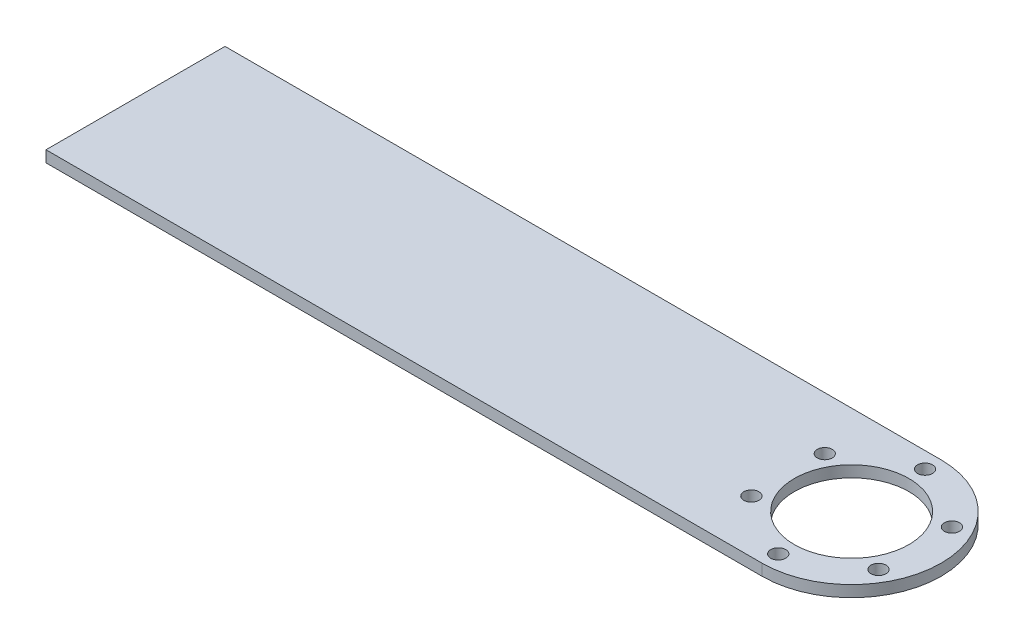
ISO-10303-21;
HEADER;
FILE_DESCRIPTION(('STEP AP214'),'2;1');
FILE_NAME('part.step','',(''),(''),'','','');
FILE_SCHEMA(('AUTOMOTIVE_DESIGN { 1 0 10303 214 1 1 1 1 }'));
ENDSEC;
DATA;
#1=APPLICATION_CONTEXT('core data for automotive mechanical design processes');
#2=APPLICATION_PROTOCOL_DEFINITION('international standard','automotive_design',2000,#1);
#3=PRODUCT_CONTEXT('',#1,'mechanical');
#4=PRODUCT('Part','Part','',(#3));
#5=PRODUCT_RELATED_PRODUCT_CATEGORY('part','',(#4));
#6=PRODUCT_DEFINITION_FORMATION('','',#4);
#7=PRODUCT_DEFINITION_CONTEXT('part definition',#1,'design');
#8=PRODUCT_DEFINITION('design','',#6,#7);
#9=PRODUCT_DEFINITION_SHAPE('','',#8);
#10=(LENGTH_UNIT() NAMED_UNIT(*) SI_UNIT(.MILLI.,.METRE.));
#11=(NAMED_UNIT(*) PLANE_ANGLE_UNIT() SI_UNIT($,.RADIAN.));
#12=(NAMED_UNIT(*) SI_UNIT($,.STERADIAN.) SOLID_ANGLE_UNIT());
#13=UNCERTAINTY_MEASURE_WITH_UNIT(LENGTH_MEASURE(1.E-05),#10,'distance_accuracy_value','');
#14=(GEOMETRIC_REPRESENTATION_CONTEXT(3) GLOBAL_UNCERTAINTY_ASSIGNED_CONTEXT((#13)) GLOBAL_UNIT_ASSIGNED_CONTEXT((#10,
#11,#12)) REPRESENTATION_CONTEXT('',''));
#15=CARTESIAN_POINT('',(0.,0.,0.));
#16=DIRECTION('',(0.,0.,1.));
#17=DIRECTION('',(1.,0.,0.));
#18=AXIS2_PLACEMENT_3D('',#15,#16,#17);
#19=CARTESIAN_POINT('',(100.,3.175,0.));
#20=DIRECTION('',(0.,-1.,0.));
#21=DIRECTION('',(0.,0.,-1.));
#22=AXIS2_PLACEMENT_3D('',#19,#20,#21);
#23=CYLINDRICAL_SURFACE('',#22,25.);
#24=CARTESIAN_POINT('',(100.,0.,0.));
#25=DIRECTION('',(0.,1.,0.));
#26=DIRECTION('',(0.,0.,1.));
#27=AXIS2_PLACEMENT_3D('',#24,#25,#26);
#28=CIRCLE('',#27,25.);
#29=CARTESIAN_POINT('',(100.,0.,25.));
#30=VERTEX_POINT('',#29);
#31=CARTESIAN_POINT('',(100.,0.,-25.));
#32=VERTEX_POINT('',#31);
#33=EDGE_CURVE('E111',#30,#32,#28,.T.);
#34=ORIENTED_EDGE('',*,*,#33,.T.);
#35=DIRECTION('',(0.,-1.,0.));
#36=VECTOR('',#35,1.);
#37=CARTESIAN_POINT('',(100.,3.175,-25.));
#38=LINE('',#37,#36);
#39=CARTESIAN_POINT('',(100.,3.175,-25.));
#40=VERTEX_POINT('',#39);
#41=EDGE_CURVE('E11',#40,#32,#38,.T.);
#42=ORIENTED_EDGE('',*,*,#41,.F.);
#43=CARTESIAN_POINT('',(100.,3.175,0.));
#44=DIRECTION('',(0.,1.,0.));
#45=DIRECTION('',(0.,0.,1.));
#46=AXIS2_PLACEMENT_3D('',#43,#44,#45);
#47=CIRCLE('',#46,25.);
#48=CARTESIAN_POINT('',(100.,3.175,25.));
#49=VERTEX_POINT('',#48);
#50=EDGE_CURVE('E95',#49,#40,#47,.T.);
#51=ORIENTED_EDGE('',*,*,#50,.F.);
#52=DIRECTION('',(0.,-1.,0.));
#53=VECTOR('',#52,1.);
#54=CARTESIAN_POINT('',(100.,3.175,25.));
#55=LINE('',#54,#53);
#56=EDGE_CURVE('E107',#49,#30,#55,.T.);
#57=ORIENTED_EDGE('',*,*,#56,.T.);
#58=EDGE_LOOP('',(#34,#42,#51,#57));
#59=FACE_BOUND('',#58,.T.);
#60=ADVANCED_FACE('F43',(#59),#23,.T.);
#61=CARTESIAN_POINT('',(-100.,3.175,-25.));
#62=DIRECTION('',(0.,0.,1.));
#63=DIRECTION('',(1.,0.,0.));
#64=AXIS2_PLACEMENT_3D('',#61,#62,#63);
#65=PLANE('',#64);
#66=DIRECTION('',(-1.,0.,0.));
#67=VECTOR('',#66,1.);
#68=CARTESIAN_POINT('',(-100.,0.,-25.));
#69=LINE('',#68,#67);
#70=CARTESIAN_POINT('',(-100.,0.,-25.));
#71=VERTEX_POINT('',#70);
#72=EDGE_CURVE('E100',#32,#71,#69,.T.);
#73=ORIENTED_EDGE('',*,*,#72,.T.);
#74=DIRECTION('',(0.,-1.,0.));
#75=VECTOR('',#74,1.);
#76=CARTESIAN_POINT('',(-100.,3.175,-25.));
#77=LINE('',#76,#75);
#78=CARTESIAN_POINT('',(-100.,3.175,-25.));
#79=VERTEX_POINT('',#78);
#80=EDGE_CURVE('E52',#79,#71,#77,.T.);
#81=ORIENTED_EDGE('',*,*,#80,.F.);
#82=DIRECTION('',(-1.,0.,0.));
#83=VECTOR('',#82,1.);
#84=CARTESIAN_POINT('',(-100.,3.175,-25.));
#85=LINE('',#84,#83);
#86=EDGE_CURVE('E90',#40,#79,#85,.T.);
#87=ORIENTED_EDGE('',*,*,#86,.F.);
#88=ORIENTED_EDGE('',*,*,#41,.T.);
#89=EDGE_LOOP('',(#73,#81,#87,#88));
#90=FACE_BOUND('',#89,.T.);
#91=ADVANCED_FACE('F99',(#90),#65,.F.);
#92=CARTESIAN_POINT('',(-100.,3.175,25.));
#93=DIRECTION('',(1.,0.,0.));
#94=DIRECTION('',(0.,0.,-1.));
#95=AXIS2_PLACEMENT_3D('',#92,#93,#94);
#96=PLANE('',#95);
#97=DIRECTION('',(0.,0.,1.));
#98=VECTOR('',#97,1.);
#99=CARTESIAN_POINT('',(-100.,0.,25.));
#100=LINE('',#99,#98);
#101=CARTESIAN_POINT('',(-100.,0.,25.));
#102=VERTEX_POINT('',#101);
#103=EDGE_CURVE('E77',#71,#102,#100,.T.);
#104=ORIENTED_EDGE('',*,*,#103,.T.);
#105=DIRECTION('',(0.,-1.,0.));
#106=VECTOR('',#105,1.);
#107=CARTESIAN_POINT('',(-100.,3.175,25.));
#108=LINE('',#107,#106);
#109=CARTESIAN_POINT('',(-100.,3.175,25.));
#110=VERTEX_POINT('',#109);
#111=EDGE_CURVE('E102',#110,#102,#108,.T.);
#112=ORIENTED_EDGE('',*,*,#111,.F.);
#113=DIRECTION('',(0.,0.,1.));
#114=VECTOR('',#113,1.);
#115=CARTESIAN_POINT('',(-100.,3.175,25.));
#116=LINE('',#115,#114);
#117=EDGE_CURVE('E93',#79,#110,#116,.T.);
#118=ORIENTED_EDGE('',*,*,#117,.F.);
#119=ORIENTED_EDGE('',*,*,#80,.T.);
#120=EDGE_LOOP('',(#104,#112,#118,#119));
#121=FACE_BOUND('',#120,.T.);
#122=ADVANCED_FACE('F103',(#121),#96,.F.);
#123=CARTESIAN_POINT('',(-100.,3.175,25.));
#124=DIRECTION('',(0.,0.,-1.));
#125=DIRECTION('',(-1.,0.,0.));
#126=AXIS2_PLACEMENT_3D('',#123,#124,#125);
#127=PLANE('',#126);
#128=DIRECTION('',(1.,0.,0.));
#129=VECTOR('',#128,1.);
#130=CARTESIAN_POINT('',(-100.,0.,25.));
#131=LINE('',#130,#129);
#132=EDGE_CURVE('E83',#102,#30,#131,.T.);
#133=ORIENTED_EDGE('',*,*,#132,.T.);
#134=ORIENTED_EDGE('',*,*,#56,.F.);
#135=DIRECTION('',(1.,0.,0.));
#136=VECTOR('',#135,1.);
#137=CARTESIAN_POINT('',(-100.,3.175,25.));
#138=LINE('',#137,#136);
#139=EDGE_CURVE('E60',#110,#49,#138,.T.);
#140=ORIENTED_EDGE('',*,*,#139,.F.);
#141=ORIENTED_EDGE('',*,*,#111,.T.);
#142=EDGE_LOOP('',(#133,#134,#140,#141));
#143=FACE_BOUND('',#142,.T.);
#144=ADVANCED_FACE('F125',(#143),#127,.F.);
#145=CARTESIAN_POINT('',(100.,3.175,0.));
#146=DIRECTION('',(0.,1.,0.));
#147=DIRECTION('',(0.,0.,1.));
#148=AXIS2_PLACEMENT_3D('',#145,#146,#147);
#149=PLANE('',#148);
#150=CARTESIAN_POINT('',(82.2464792224196,3.175,-10.2499999999995));
#151=DIRECTION('',(0.,1.,0.));
#152=DIRECTION('',(0.,0.,1.));
#153=AXIS2_PLACEMENT_3D('',#150,#151,#152);
#154=CIRCLE('',#153,2.10000000000001);
#155=CARTESIAN_POINT('',(82.2464792224196,3.175,-8.14999999999944));
#156=VERTEX_POINT('',#155);
#157=EDGE_CURVE('E144',#156,#156,#154,.T.);
#158=ORIENTED_EDGE('',*,*,#157,.F.);
#159=EDGE_LOOP('',(#158));
#160=FACE_BOUND('',#159,.T.);
#161=CARTESIAN_POINT('',(82.2464792224203,3.175,10.2500000000006));
#162=DIRECTION('',(0.,1.,0.));
#163=DIRECTION('',(0.,0.,1.));
#164=AXIS2_PLACEMENT_3D('',#161,#162,#163);
#165=CIRCLE('',#164,2.10000000000001);
#166=CARTESIAN_POINT('',(82.2464792224203,3.175,12.3500000000006));
#167=VERTEX_POINT('',#166);
#168=EDGE_CURVE('E152',#167,#167,#165,.T.);
#169=ORIENTED_EDGE('',*,*,#168,.F.);
#170=EDGE_LOOP('',(#169));
#171=FACE_BOUND('',#170,.T.);
#172=CARTESIAN_POINT('',(100.,3.175,20.5));
#173=DIRECTION('',(0.,1.,0.));
#174=DIRECTION('',(0.,0.,1.));
#175=AXIS2_PLACEMENT_3D('',#172,#173,#174);
#176=CIRCLE('',#175,2.09999999999847);
#177=CARTESIAN_POINT('',(100.,3.175,22.5999999999985));
#178=VERTEX_POINT('',#177);
#179=EDGE_CURVE('E160',#178,#178,#176,.T.);
#180=ORIENTED_EDGE('',*,*,#179,.F.);
#181=EDGE_LOOP('',(#180));
#182=FACE_BOUND('',#181,.T.);
#183=CARTESIAN_POINT('',(117.753520777581,3.175,10.25));
#184=DIRECTION('',(0.,1.,0.));
#185=DIRECTION('',(0.,0.,1.));
#186=AXIS2_PLACEMENT_3D('',#183,#184,#185);
#187=CIRCLE('',#186,2.09999999999908);
#188=CARTESIAN_POINT('',(117.753520777581,3.175,12.3499999999991));
#189=VERTEX_POINT('',#188);
#190=EDGE_CURVE('E168',#189,#189,#187,.T.);
#191=ORIENTED_EDGE('',*,*,#190,.F.);
#192=EDGE_LOOP('',(#191));
#193=FACE_BOUND('',#192,.T.);
#194=CARTESIAN_POINT('',(117.753520777581,3.175,-10.2500000000007));
#195=DIRECTION('',(0.,1.,0.));
#196=DIRECTION('',(0.,0.,1.));
#197=AXIS2_PLACEMENT_3D('',#194,#195,#196);
#198=CIRCLE('',#197,2.1);
#199=CARTESIAN_POINT('',(117.753520777581,3.175,-8.15000000000073));
#200=VERTEX_POINT('',#199);
#201=EDGE_CURVE('E176',#200,#200,#198,.T.);
#202=ORIENTED_EDGE('',*,*,#201,.F.);
#203=EDGE_LOOP('',(#202));
#204=FACE_BOUND('',#203,.T.);
#205=CARTESIAN_POINT('',(100.,3.175,-20.5));
#206=DIRECTION('',(0.,1.,0.));
#207=DIRECTION('',(0.,0.,1.));
#208=AXIS2_PLACEMENT_3D('',#205,#206,#207);
#209=CIRCLE('',#208,2.1);
#210=CARTESIAN_POINT('',(100.,3.175,-18.4));
#211=VERTEX_POINT('',#210);
#212=EDGE_CURVE('E136',#211,#211,#209,.T.);
#213=ORIENTED_EDGE('',*,*,#212,.F.);
#214=EDGE_LOOP('',(#213));
#215=FACE_BOUND('',#214,.T.);
#216=CARTESIAN_POINT('',(100.,3.175,0.));
#217=DIRECTION('',(0.,1.,0.));
#218=DIRECTION('',(0.,0.,1.));
#219=AXIS2_PLACEMENT_3D('',#216,#217,#218);
#220=CIRCLE('',#219,16.);
#221=CARTESIAN_POINT('',(100.,3.175,16.));
#222=VERTEX_POINT('',#221);
#223=EDGE_CURVE('E132',#222,#222,#220,.T.);
#224=ORIENTED_EDGE('',*,*,#223,.F.);
#225=EDGE_LOOP('',(#224));
#226=FACE_BOUND('',#225,.T.);
#227=ORIENTED_EDGE('',*,*,#50,.T.);
#228=ORIENTED_EDGE('',*,*,#86,.T.);
#229=ORIENTED_EDGE('',*,*,#117,.T.);
#230=ORIENTED_EDGE('',*,*,#139,.T.);
#231=EDGE_LOOP('',(#227,#228,#229,#230));
#232=FACE_BOUND('',#231,.T.);
#233=ADVANCED_FACE('F91',(#160,#171,#182,#193,#204,#215,#226,#232),#149,.T.);
#234=CARTESIAN_POINT('',(100.,0.,0.));
#235=DIRECTION('',(0.,1.,0.));
#236=DIRECTION('',(0.,0.,1.));
#237=AXIS2_PLACEMENT_3D('',#234,#235,#236);
#238=PLANE('',#237);
#239=CARTESIAN_POINT('',(82.2464792224196,0.,-10.2499999999995));
#240=DIRECTION('',(0.,1.,0.));
#241=DIRECTION('',(0.,0.,1.));
#242=AXIS2_PLACEMENT_3D('',#239,#240,#241);
#243=CIRCLE('',#242,2.10000000000001);
#244=CARTESIAN_POINT('',(82.2464792224196,0.,-8.14999999999944));
#245=VERTEX_POINT('',#244);
#246=EDGE_CURVE('E140',#245,#245,#243,.T.);
#247=ORIENTED_EDGE('',*,*,#246,.T.);
#248=EDGE_LOOP('',(#247));
#249=FACE_BOUND('',#248,.T.);
#250=CARTESIAN_POINT('',(82.2464792224203,0.,10.2500000000006));
#251=DIRECTION('',(0.,1.,0.));
#252=DIRECTION('',(0.,0.,1.));
#253=AXIS2_PLACEMENT_3D('',#250,#251,#252);
#254=CIRCLE('',#253,2.10000000000001);
#255=CARTESIAN_POINT('',(82.2464792224203,0.,12.3500000000006));
#256=VERTEX_POINT('',#255);
#257=EDGE_CURVE('E148',#256,#256,#254,.T.);
#258=ORIENTED_EDGE('',*,*,#257,.T.);
#259=EDGE_LOOP('',(#258));
#260=FACE_BOUND('',#259,.T.);
#261=CARTESIAN_POINT('',(100.,0.,20.5));
#262=DIRECTION('',(0.,1.,0.));
#263=DIRECTION('',(0.,0.,1.));
#264=AXIS2_PLACEMENT_3D('',#261,#262,#263);
#265=CIRCLE('',#264,2.09999999999847);
#266=CARTESIAN_POINT('',(100.,0.,22.5999999999985));
#267=VERTEX_POINT('',#266);
#268=EDGE_CURVE('E156',#267,#267,#265,.T.);
#269=ORIENTED_EDGE('',*,*,#268,.T.);
#270=EDGE_LOOP('',(#269));
#271=FACE_BOUND('',#270,.T.);
#272=CARTESIAN_POINT('',(117.753520777581,0.,10.25));
#273=DIRECTION('',(0.,1.,0.));
#274=DIRECTION('',(0.,0.,1.));
#275=AXIS2_PLACEMENT_3D('',#272,#273,#274);
#276=CIRCLE('',#275,2.09999999999908);
#277=CARTESIAN_POINT('',(117.753520777581,0.,12.3499999999991));
#278=VERTEX_POINT('',#277);
#279=EDGE_CURVE('E164',#278,#278,#276,.T.);
#280=ORIENTED_EDGE('',*,*,#279,.T.);
#281=EDGE_LOOP('',(#280));
#282=FACE_BOUND('',#281,.T.);
#283=CARTESIAN_POINT('',(117.753520777581,0.,-10.2500000000007));
#284=DIRECTION('',(0.,1.,0.));
#285=DIRECTION('',(0.,0.,1.));
#286=AXIS2_PLACEMENT_3D('',#283,#284,#285);
#287=CIRCLE('',#286,2.1);
#288=CARTESIAN_POINT('',(117.753520777581,0.,-8.15000000000073));
#289=VERTEX_POINT('',#288);
#290=EDGE_CURVE('E172',#289,#289,#287,.T.);
#291=ORIENTED_EDGE('',*,*,#290,.T.);
#292=EDGE_LOOP('',(#291));
#293=FACE_BOUND('',#292,.T.);
#294=CARTESIAN_POINT('',(100.,0.,-20.5));
#295=DIRECTION('',(0.,1.,0.));
#296=DIRECTION('',(0.,0.,1.));
#297=AXIS2_PLACEMENT_3D('',#294,#295,#296);
#298=CIRCLE('',#297,2.1);
#299=CARTESIAN_POINT('',(100.,0.,-18.4));
#300=VERTEX_POINT('',#299);
#301=EDGE_CURVE('E180',#300,#300,#298,.T.);
#302=ORIENTED_EDGE('',*,*,#301,.T.);
#303=EDGE_LOOP('',(#302));
#304=FACE_BOUND('',#303,.T.);
#305=CARTESIAN_POINT('',(100.,0.,0.));
#306=DIRECTION('',(0.,1.,0.));
#307=DIRECTION('',(0.,0.,1.));
#308=AXIS2_PLACEMENT_3D('',#305,#306,#307);
#309=CIRCLE('',#308,16.);
#310=CARTESIAN_POINT('',(100.,0.,16.));
#311=VERTEX_POINT('',#310);
#312=EDGE_CURVE('E115',#311,#311,#309,.T.);
#313=ORIENTED_EDGE('',*,*,#312,.T.);
#314=EDGE_LOOP('',(#313));
#315=FACE_BOUND('',#314,.T.);
#316=ORIENTED_EDGE('',*,*,#33,.F.);
#317=ORIENTED_EDGE('',*,*,#132,.F.);
#318=ORIENTED_EDGE('',*,*,#103,.F.);
#319=ORIENTED_EDGE('',*,*,#72,.F.);
#320=EDGE_LOOP('',(#316,#317,#318,#319));
#321=FACE_BOUND('',#320,.T.);
#322=ADVANCED_FACE('F128',(#249,#260,#271,#282,#293,#304,#315,#321),#238,.F.);
#323=CARTESIAN_POINT('',(100.,0.,0.));
#324=DIRECTION('',(0.,1.,0.));
#325=DIRECTION('',(0.,0.,1.));
#326=AXIS2_PLACEMENT_3D('',#323,#324,#325);
#327=CYLINDRICAL_SURFACE('',#326,16.);
#328=ORIENTED_EDGE('',*,*,#312,.F.);
#329=EDGE_LOOP('',(#328));
#330=FACE_BOUND('',#329,.T.);
#331=ORIENTED_EDGE('',*,*,#223,.T.);
#332=EDGE_LOOP('',(#331));
#333=FACE_BOUND('',#332,.T.);
#334=ADVANCED_FACE('F196',(#330,#333),#327,.F.);
#335=CARTESIAN_POINT('',(100.,0.,-20.5));
#336=DIRECTION('',(0.,1.,0.));
#337=DIRECTION('',(0.,0.,1.));
#338=AXIS2_PLACEMENT_3D('',#335,#336,#337);
#339=CYLINDRICAL_SURFACE('',#338,2.1);
#340=ORIENTED_EDGE('',*,*,#301,.F.);
#341=EDGE_LOOP('',(#340));
#342=FACE_BOUND('',#341,.T.);
#343=ORIENTED_EDGE('',*,*,#212,.T.);
#344=EDGE_LOOP('',(#343));
#345=FACE_BOUND('',#344,.T.);
#346=ADVANCED_FACE('F188',(#342,#345),#339,.F.);
#347=CARTESIAN_POINT('',(117.753520777581,0.,-10.2500000000007));
#348=DIRECTION('',(0.,1.,0.));
#349=DIRECTION('',(0.,0.,1.));
#350=AXIS2_PLACEMENT_3D('',#347,#348,#349);
#351=CYLINDRICAL_SURFACE('',#350,2.1);
#352=ORIENTED_EDGE('',*,*,#290,.F.);
#353=EDGE_LOOP('',(#352));
#354=FACE_BOUND('',#353,.T.);
#355=ORIENTED_EDGE('',*,*,#201,.T.);
#356=EDGE_LOOP('',(#355));
#357=FACE_BOUND('',#356,.T.);
#358=ADVANCED_FACE('F204',(#354,#357),#351,.F.);
#359=CARTESIAN_POINT('',(117.753520777581,0.,10.25));
#360=DIRECTION('',(0.,1.,0.));
#361=DIRECTION('',(0.,0.,1.));
#362=AXIS2_PLACEMENT_3D('',#359,#360,#361);
#363=CYLINDRICAL_SURFACE('',#362,2.09999999999908);
#364=ORIENTED_EDGE('',*,*,#279,.F.);
#365=EDGE_LOOP('',(#364));
#366=FACE_BOUND('',#365,.T.);
#367=ORIENTED_EDGE('',*,*,#190,.T.);
#368=EDGE_LOOP('',(#367));
#369=FACE_BOUND('',#368,.T.);
#370=ADVANCED_FACE('F255',(#366,#369),#363,.F.);
#371=CARTESIAN_POINT('',(100.,0.,20.5));
#372=DIRECTION('',(0.,1.,0.));
#373=DIRECTION('',(0.,0.,1.));
#374=AXIS2_PLACEMENT_3D('',#371,#372,#373);
#375=CYLINDRICAL_SURFACE('',#374,2.09999999999847);
#376=ORIENTED_EDGE('',*,*,#268,.F.);
#377=EDGE_LOOP('',(#376));
#378=FACE_BOUND('',#377,.T.);
#379=ORIENTED_EDGE('',*,*,#179,.T.);
#380=EDGE_LOOP('',(#379));
#381=FACE_BOUND('',#380,.T.);
#382=ADVANCED_FACE('F266',(#378,#381),#375,.F.);
#383=CARTESIAN_POINT('',(82.2464792224203,0.,10.2500000000006));
#384=DIRECTION('',(0.,1.,0.));
#385=DIRECTION('',(0.,0.,1.));
#386=AXIS2_PLACEMENT_3D('',#383,#384,#385);
#387=CYLINDRICAL_SURFACE('',#386,2.10000000000001);
#388=ORIENTED_EDGE('',*,*,#257,.F.);
#389=EDGE_LOOP('',(#388));
#390=FACE_BOUND('',#389,.T.);
#391=ORIENTED_EDGE('',*,*,#168,.T.);
#392=EDGE_LOOP('',(#391));
#393=FACE_BOUND('',#392,.T.);
#394=ADVANCED_FACE('F277',(#390,#393),#387,.F.);
#395=CARTESIAN_POINT('',(82.2464792224196,0.,-10.2499999999995));
#396=DIRECTION('',(0.,1.,0.));
#397=DIRECTION('',(0.,0.,1.));
#398=AXIS2_PLACEMENT_3D('',#395,#396,#397);
#399=CYLINDRICAL_SURFACE('',#398,2.10000000000001);
#400=ORIENTED_EDGE('',*,*,#246,.F.);
#401=EDGE_LOOP('',(#400));
#402=FACE_BOUND('',#401,.T.);
#403=ORIENTED_EDGE('',*,*,#157,.T.);
#404=EDGE_LOOP('',(#403));
#405=FACE_BOUND('',#404,.T.);
#406=ADVANCED_FACE('F288',(#402,#405),#399,.F.);
#407=CLOSED_SHELL('',(#60,#91,#122,#144,#233,#322,#334,#346,#358,#370,#382,#394,#406));
#408=MANIFOLD_SOLID_BREP('B2',#407);
#409=ADVANCED_BREP_SHAPE_REPRESENTATION('',(#18,#408),#14);
#410=SHAPE_DEFINITION_REPRESENTATION(#9,#409);
ENDSEC;
END-ISO-10303-21;
